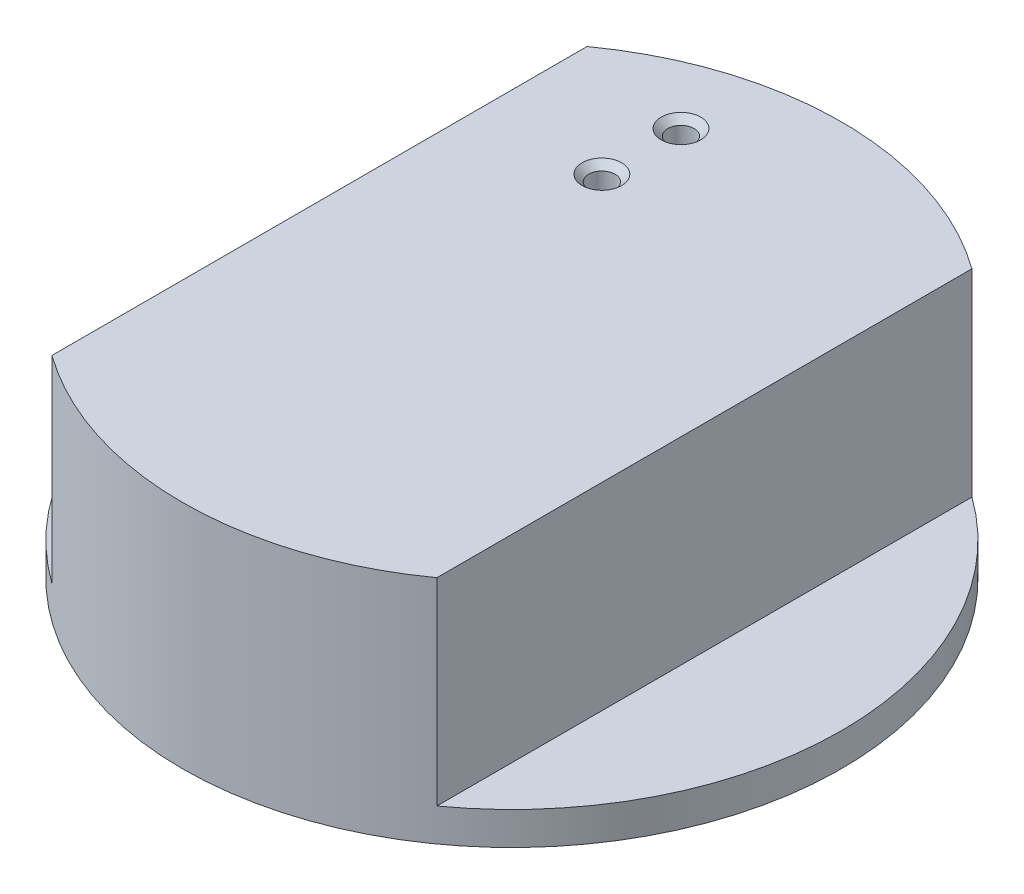
ISO-10303-21;
HEADER;
FILE_DESCRIPTION(('STEP AP214'),'2;1');
FILE_NAME('part.step','',(''),(''),'','','');
FILE_SCHEMA(('AUTOMOTIVE_DESIGN { 1 0 10303 214 1 1 1 1 }'));
ENDSEC;
DATA;
#1=APPLICATION_CONTEXT('core data for automotive mechanical design processes');
#2=APPLICATION_PROTOCOL_DEFINITION('international standard','automotive_design',2000,#1);
#3=PRODUCT_CONTEXT('',#1,'mechanical');
#4=PRODUCT('Part','Part','',(#3));
#5=PRODUCT_RELATED_PRODUCT_CATEGORY('part','',(#4));
#6=PRODUCT_DEFINITION_FORMATION('','',#4);
#7=PRODUCT_DEFINITION_CONTEXT('part definition',#1,'design');
#8=PRODUCT_DEFINITION('design','',#6,#7);
#9=PRODUCT_DEFINITION_SHAPE('','',#8);
#10=(LENGTH_UNIT() NAMED_UNIT(*) SI_UNIT(.MILLI.,.METRE.));
#11=(NAMED_UNIT(*) PLANE_ANGLE_UNIT() SI_UNIT($,.RADIAN.));
#12=(NAMED_UNIT(*) SI_UNIT($,.STERADIAN.) SOLID_ANGLE_UNIT());
#13=UNCERTAINTY_MEASURE_WITH_UNIT(LENGTH_MEASURE(1.E-05),#10,'distance_accuracy_value','');
#14=(GEOMETRIC_REPRESENTATION_CONTEXT(3) GLOBAL_UNCERTAINTY_ASSIGNED_CONTEXT((#13)) GLOBAL_UNIT_ASSIGNED_CONTEXT((#10,
#11,#12)) REPRESENTATION_CONTEXT('',''));
#15=CARTESIAN_POINT('',(0.,0.,0.));
#16=DIRECTION('',(0.,0.,1.));
#17=DIRECTION('',(1.,0.,0.));
#18=AXIS2_PLACEMENT_3D('',#15,#16,#17);
#19=CARTESIAN_POINT('',(0.,0.,0.));
#20=DIRECTION('',(0.,1.,0.));
#21=DIRECTION('',(0.,0.,1.));
#22=AXIS2_PLACEMENT_3D('',#19,#20,#21);
#23=PLANE('',#22);
#24=CARTESIAN_POINT('',(0.,0.,0.));
#25=DIRECTION('',(0.,1.,0.));
#26=DIRECTION('',(0.,0.,1.));
#27=AXIS2_PLACEMENT_3D('',#24,#25,#26);
#28=CIRCLE('',#27,50.);
#29=CARTESIAN_POINT('',(29.1990466005406,0.,40.5883687479487));
#30=VERTEX_POINT('',#29);
#31=CARTESIAN_POINT('',(29.1990466005406,0.,-40.5883687479487));
#32=VERTEX_POINT('',#31);
#33=EDGE_CURVE('E68',#30,#32,#28,.T.);
#34=ORIENTED_EDGE('',*,*,#33,.T.);
#35=DIRECTION('',(0.,0.,1.));
#36=VECTOR('',#35,1.);
#37=CARTESIAN_POINT('',(29.1990466005406,0.,0.));
#38=LINE('',#37,#36);
#39=EDGE_CURVE('E106',#32,#30,#38,.T.);
#40=ORIENTED_EDGE('',*,*,#39,.T.);
#41=EDGE_LOOP('',(#34,#40));
#42=FACE_BOUND('',#41,.T.);
#43=ADVANCED_FACE('F46',(#42),#23,.T.);
#44=CARTESIAN_POINT('',(0.,-5.,0.));
#45=DIRECTION('',(0.,1.,0.));
#46=DIRECTION('',(0.,0.,1.));
#47=AXIS2_PLACEMENT_3D('',#44,#45,#46);
#48=CYLINDRICAL_SURFACE('',#47,50.);
#49=CARTESIAN_POINT('',(0.,-5.,0.));
#50=DIRECTION('',(0.,1.,0.));
#51=DIRECTION('',(0.,0.,1.));
#52=AXIS2_PLACEMENT_3D('',#49,#50,#51);
#53=CIRCLE('',#52,50.);
#54=CARTESIAN_POINT('',(0.,-5.,50.));
#55=VERTEX_POINT('',#54);
#56=EDGE_CURVE('E116',#55,#55,#53,.T.);
#57=ORIENTED_EDGE('',*,*,#56,.T.);
#58=EDGE_LOOP('',(#57));
#59=FACE_BOUND('',#58,.T.);
#60=ORIENTED_EDGE('',*,*,#33,.F.);
#61=DIRECTION('',(0.,-1.,0.));
#62=VECTOR('',#61,1.);
#63=CARTESIAN_POINT('',(29.1990466005406,30.,40.5883687479487));
#64=LINE('',#63,#62);
#65=CARTESIAN_POINT('',(29.1990466005406,30.,40.5883687479487));
#66=VERTEX_POINT('',#65);
#67=EDGE_CURVE('E112',#66,#30,#64,.T.);
#68=ORIENTED_EDGE('',*,*,#67,.F.);
#69=CARTESIAN_POINT('',(0.,30.,0.));
#70=DIRECTION('',(0.,1.,0.));
#71=DIRECTION('',(0.,0.,1.));
#72=AXIS2_PLACEMENT_3D('',#69,#70,#71);
#73=CIRCLE('',#72,50.);
#74=CARTESIAN_POINT('',(-29.1990466005406,30.,40.5883687479487));
#75=VERTEX_POINT('',#74);
#76=EDGE_CURVE('E97',#75,#66,#73,.T.);
#77=ORIENTED_EDGE('',*,*,#76,.F.);
#78=DIRECTION('',(0.,-1.,0.));
#79=VECTOR('',#78,1.);
#80=CARTESIAN_POINT('',(-29.1990466005406,30.,40.5883687479487));
#81=LINE('',#80,#79);
#82=CARTESIAN_POINT('',(-29.1990466005406,0.,40.5883687479487));
#83=VERTEX_POINT('',#82);
#84=EDGE_CURVE('E94',#75,#83,#81,.T.);
#85=ORIENTED_EDGE('',*,*,#84,.T.);
#86=CARTESIAN_POINT('',(-29.1990466005406,0.,-40.5883687479487));
#87=VERTEX_POINT('',#86);
#88=EDGE_CURVE('E109',#87,#83,#28,.T.);
#89=ORIENTED_EDGE('',*,*,#88,.F.);
#90=DIRECTION('',(0.,-1.,0.));
#91=VECTOR('',#90,1.);
#92=CARTESIAN_POINT('',(-29.1990466005406,30.,-40.5883687479487));
#93=LINE('',#92,#91);
#94=CARTESIAN_POINT('',(-29.1990466005406,30.,-40.5883687479487));
#95=VERTEX_POINT('',#94);
#96=EDGE_CURVE('E92',#95,#87,#93,.T.);
#97=ORIENTED_EDGE('',*,*,#96,.F.);
#98=CARTESIAN_POINT('',(29.1990466005406,30.,-40.5883687479487));
#99=VERTEX_POINT('',#98);
#100=EDGE_CURVE('E98',#99,#95,#73,.T.);
#101=ORIENTED_EDGE('',*,*,#100,.F.);
#102=DIRECTION('',(0.,-1.,0.));
#103=VECTOR('',#102,1.);
#104=CARTESIAN_POINT('',(29.1990466005406,30.,-40.5883687479487));
#105=LINE('',#104,#103);
#106=EDGE_CURVE('E149',#99,#32,#105,.T.);
#107=ORIENTED_EDGE('',*,*,#106,.T.);
#108=EDGE_LOOP('',(#60,#68,#77,#85,#89,#97,#101,#107));
#109=FACE_BOUND('',#108,.T.);
#110=ADVANCED_FACE('F108',(#59,#109),#48,.T.);
#111=CARTESIAN_POINT('',(0.,-5.,0.));
#112=DIRECTION('',(0.,1.,0.));
#113=DIRECTION('',(0.,0.,1.));
#114=AXIS2_PLACEMENT_3D('',#111,#112,#113);
#115=PLANE('',#114);
#116=CARTESIAN_POINT('',(-11.3,-5.,-36.9427649286171));
#117=DIRECTION('',(0.,1.,0.));
#118=DIRECTION('',(0.,0.,1.));
#119=AXIS2_PLACEMENT_3D('',#116,#117,#118);
#120=CIRCLE('',#119,2.);
#121=CARTESIAN_POINT('',(-11.3,-5.,-34.9427649286171));
#122=VERTEX_POINT('',#121);
#123=EDGE_CURVE('E141',#122,#122,#120,.T.);
#124=ORIENTED_EDGE('',*,*,#123,.T.);
#125=EDGE_LOOP('',(#124));
#126=FACE_BOUND('',#125,.T.);
#127=CARTESIAN_POINT('',(-11.3,-5.,-24.9427649286171));
#128=DIRECTION('',(0.,1.,0.));
#129=DIRECTION('',(0.,0.,-1.));
#130=AXIS2_PLACEMENT_3D('',#127,#128,#129);
#131=CIRCLE('',#130,2.);
#132=CARTESIAN_POINT('',(-11.3,-5.,-26.9427649286171));
#133=VERTEX_POINT('',#132);
#134=EDGE_CURVE('E143',#133,#133,#131,.T.);
#135=ORIENTED_EDGE('',*,*,#134,.T.);
#136=EDGE_LOOP('',(#135));
#137=FACE_BOUND('',#136,.T.);
#138=ORIENTED_EDGE('',*,*,#56,.F.);
#139=EDGE_LOOP('',(#138));
#140=FACE_BOUND('',#139,.T.);
#141=ADVANCED_FACE('F163',(#126,#137,#140),#115,.F.);
#142=DIRECTION('',(0.,0.,1.));
#143=VECTOR('',#142,1.);
#144=CARTESIAN_POINT('',(-29.1990466005406,0.,0.));
#145=LINE('',#144,#143);
#146=EDGE_CURVE('E61',#87,#83,#145,.T.);
#147=ORIENTED_EDGE('',*,*,#146,.F.);
#148=ORIENTED_EDGE('',*,*,#88,.T.);
#149=EDGE_LOOP('',(#147,#148));
#150=FACE_BOUND('',#149,.T.);
#151=ADVANCED_FACE('F159',(#150),#23,.T.);
#152=CARTESIAN_POINT('',(-29.1990466005406,30.,0.));
#153=DIRECTION('',(1.,0.,0.));
#154=DIRECTION('',(0.,0.,-1.));
#155=AXIS2_PLACEMENT_3D('',#152,#153,#154);
#156=PLANE('',#155);
#157=ORIENTED_EDGE('',*,*,#146,.T.);
#158=ORIENTED_EDGE('',*,*,#84,.F.);
#159=DIRECTION('',(0.,0.,1.));
#160=VECTOR('',#159,1.);
#161=CARTESIAN_POINT('',(-29.1990466005406,30.,0.));
#162=LINE('',#161,#160);
#163=EDGE_CURVE('E88',#95,#75,#162,.T.);
#164=ORIENTED_EDGE('',*,*,#163,.F.);
#165=ORIENTED_EDGE('',*,*,#96,.T.);
#166=EDGE_LOOP('',(#157,#158,#164,#165));
#167=FACE_BOUND('',#166,.T.);
#168=ADVANCED_FACE('F90',(#167),#156,.F.);
#169=CARTESIAN_POINT('',(29.1990466005406,30.,0.));
#170=DIRECTION('',(1.,0.,0.));
#171=DIRECTION('',(0.,0.,-1.));
#172=AXIS2_PLACEMENT_3D('',#169,#170,#171);
#173=PLANE('',#172);
#174=ORIENTED_EDGE('',*,*,#39,.F.);
#175=ORIENTED_EDGE('',*,*,#106,.F.);
#176=DIRECTION('',(0.,0.,1.));
#177=VECTOR('',#176,1.);
#178=CARTESIAN_POINT('',(29.1990466005406,30.,0.));
#179=LINE('',#178,#177);
#180=EDGE_CURVE('E104',#99,#66,#179,.T.);
#181=ORIENTED_EDGE('',*,*,#180,.T.);
#182=ORIENTED_EDGE('',*,*,#67,.T.);
#183=EDGE_LOOP('',(#174,#175,#181,#182));
#184=FACE_BOUND('',#183,.T.);
#185=ADVANCED_FACE('F156',(#184),#173,.T.);
#186=CARTESIAN_POINT('',(0.,30.,0.));
#187=DIRECTION('',(0.,1.,0.));
#188=DIRECTION('',(0.,0.,1.));
#189=AXIS2_PLACEMENT_3D('',#186,#187,#188);
#190=PLANE('',#189);
#191=CARTESIAN_POINT('',(-11.3,30.,-36.9427649286171));
#192=DIRECTION('',(0.,1.,0.));
#193=DIRECTION('',(0.,0.,1.));
#194=AXIS2_PLACEMENT_3D('',#191,#192,#193);
#195=CIRCLE('',#194,3.00000000000004);
#196=CARTESIAN_POINT('',(-11.3,30.,-33.9427649286171));
#197=VERTEX_POINT('',#196);
#198=EDGE_CURVE('E55',#197,#197,#195,.F.);
#199=ORIENTED_EDGE('',*,*,#198,.T.);
#200=EDGE_LOOP('',(#199));
#201=FACE_BOUND('',#200,.T.);
#202=CARTESIAN_POINT('',(-11.3,30.,-24.9427649286171));
#203=DIRECTION('',(0.,1.,0.));
#204=DIRECTION('',(0.,0.,1.));
#205=AXIS2_PLACEMENT_3D('',#202,#203,#204);
#206=CIRCLE('',#205,3.00000000000004);
#207=CARTESIAN_POINT('',(-11.3,30.,-21.9427649286171));
#208=VERTEX_POINT('',#207);
#209=EDGE_CURVE('E122',#208,#208,#206,.F.);
#210=ORIENTED_EDGE('',*,*,#209,.T.);
#211=EDGE_LOOP('',(#210));
#212=FACE_BOUND('',#211,.T.);
#213=ORIENTED_EDGE('',*,*,#100,.T.);
#214=ORIENTED_EDGE('',*,*,#163,.T.);
#215=ORIENTED_EDGE('',*,*,#76,.T.);
#216=ORIENTED_EDGE('',*,*,#180,.F.);
#217=EDGE_LOOP('',(#213,#214,#215,#216));
#218=FACE_BOUND('',#217,.T.);
#219=ADVANCED_FACE('F102',(#201,#212,#218),#190,.T.);
#220=CARTESIAN_POINT('',(-11.3,-5.,-24.9427649286171));
#221=DIRECTION('',(0.,1.,0.));
#222=DIRECTION('',(0.,0.,1.));
#223=AXIS2_PLACEMENT_3D('',#220,#221,#222);
#224=CYLINDRICAL_SURFACE('',#223,2.);
#225=CARTESIAN_POINT('',(-11.3,29.,-24.9427649286171));
#226=DIRECTION('',(0.,1.,0.));
#227=DIRECTION('',(0.,0.,1.));
#228=AXIS2_PLACEMENT_3D('',#225,#226,#227);
#229=CIRCLE('',#228,2.);
#230=CARTESIAN_POINT('',(-11.3,29.,-22.9427649286171));
#231=VERTEX_POINT('',#230);
#232=EDGE_CURVE('E11',#231,#231,#229,.T.);
#233=ORIENTED_EDGE('',*,*,#232,.T.);
#234=EDGE_LOOP('',(#233));
#235=FACE_BOUND('',#234,.T.);
#236=ORIENTED_EDGE('',*,*,#134,.F.);
#237=EDGE_LOOP('',(#236));
#238=FACE_BOUND('',#237,.T.);
#239=ADVANCED_FACE('F137',(#235,#238),#224,.F.);
#240=CARTESIAN_POINT('',(-11.3,-5.,-36.9427649286171));
#241=DIRECTION('',(0.,1.,0.));
#242=DIRECTION('',(0.,0.,1.));
#243=AXIS2_PLACEMENT_3D('',#240,#241,#242);
#244=CYLINDRICAL_SURFACE('',#243,2.);
#245=CARTESIAN_POINT('',(-11.3,29.,-36.9427649286171));
#246=DIRECTION('',(0.,1.,0.));
#247=DIRECTION('',(0.,0.,1.));
#248=AXIS2_PLACEMENT_3D('',#245,#246,#247);
#249=CIRCLE('',#248,2.);
#250=CARTESIAN_POINT('',(-11.3,29.,-34.9427649286171));
#251=VERTEX_POINT('',#250);
#252=EDGE_CURVE('E118',#251,#251,#249,.T.);
#253=ORIENTED_EDGE('',*,*,#252,.T.);
#254=EDGE_LOOP('',(#253));
#255=FACE_BOUND('',#254,.T.);
#256=ORIENTED_EDGE('',*,*,#123,.F.);
#257=EDGE_LOOP('',(#256));
#258=FACE_BOUND('',#257,.T.);
#259=ADVANCED_FACE('F132',(#255,#258),#244,.F.);
#260=CARTESIAN_POINT('',(-11.3,29.,-36.9427649286171));
#261=DIRECTION('',(0.,1.,0.));
#262=DIRECTION('',(0.,0.,1.));
#263=AXIS2_PLACEMENT_3D('',#260,#261,#262);
#264=CONICAL_SURFACE('',#263,2.,0.785398163397446);
#265=ORIENTED_EDGE('',*,*,#198,.F.);
#266=EDGE_LOOP('',(#265));
#267=FACE_BOUND('',#266,.T.);
#268=ORIENTED_EDGE('',*,*,#252,.F.);
#269=EDGE_LOOP('',(#268));
#270=FACE_BOUND('',#269,.T.);
#271=ADVANCED_FACE('F129',(#267,#270),#264,.F.);
#272=CARTESIAN_POINT('',(-11.3,29.,-24.9427649286171));
#273=DIRECTION('',(0.,1.,0.));
#274=DIRECTION('',(0.,0.,1.));
#275=AXIS2_PLACEMENT_3D('',#272,#273,#274);
#276=CONICAL_SURFACE('',#275,2.,0.785398163397446);
#277=ORIENTED_EDGE('',*,*,#209,.F.);
#278=EDGE_LOOP('',(#277));
#279=FACE_BOUND('',#278,.T.);
#280=ORIENTED_EDGE('',*,*,#232,.F.);
#281=EDGE_LOOP('',(#280));
#282=FACE_BOUND('',#281,.T.);
#283=ADVANCED_FACE('F49',(#279,#282),#276,.F.);
#284=CLOSED_SHELL('',(#43,#110,#141,#151,#168,#185,#219,#239,#259,#271,#283));
#285=MANIFOLD_SOLID_BREP('B2',#284);
#286=ADVANCED_BREP_SHAPE_REPRESENTATION('',(#18,#285),#14);
#287=SHAPE_DEFINITION_REPRESENTATION(#9,#286);
ENDSEC;
END-ISO-10303-21;
